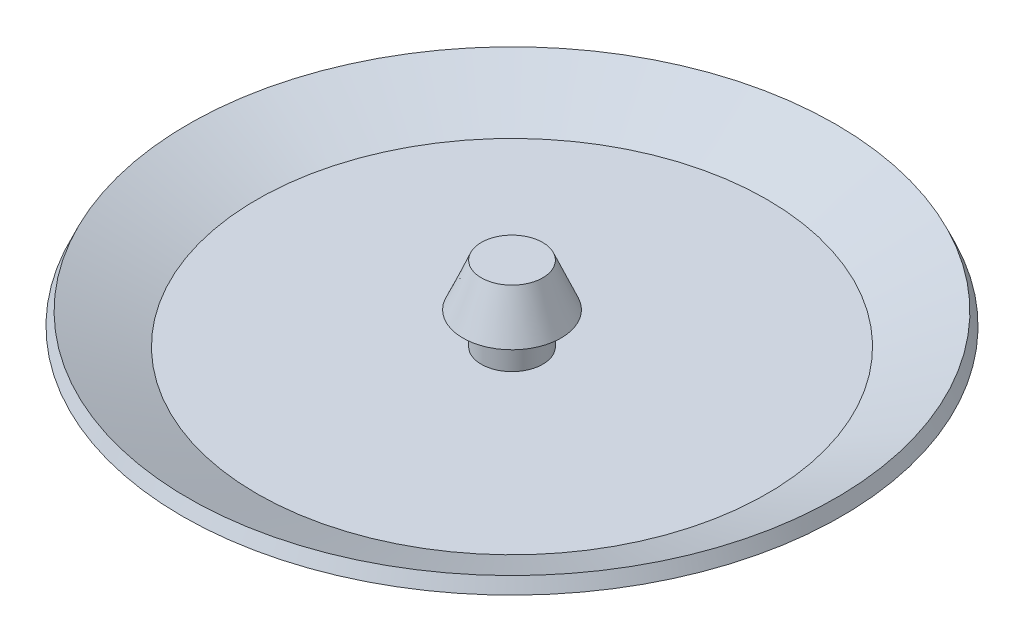
ISO-10303-21;
HEADER;
FILE_DESCRIPTION(('STEP AP214'),'2;1');
FILE_NAME('part.step','',(''),(''),'','','');
FILE_SCHEMA(('AUTOMOTIVE_DESIGN { 1 0 10303 214 1 1 1 1 }'));
ENDSEC;
DATA;
#1=APPLICATION_CONTEXT('core data for automotive mechanical design processes');
#2=APPLICATION_PROTOCOL_DEFINITION('international standard','automotive_design',2000,#1);
#3=PRODUCT_CONTEXT('',#1,'mechanical');
#4=PRODUCT('Part','Part','',(#3));
#5=PRODUCT_RELATED_PRODUCT_CATEGORY('part','',(#4));
#6=PRODUCT_DEFINITION_FORMATION('','',#4);
#7=PRODUCT_DEFINITION_CONTEXT('part definition',#1,'design');
#8=PRODUCT_DEFINITION('design','',#6,#7);
#9=PRODUCT_DEFINITION_SHAPE('','',#8);
#10=(LENGTH_UNIT() NAMED_UNIT(*) SI_UNIT(.MILLI.,.METRE.));
#11=(NAMED_UNIT(*) PLANE_ANGLE_UNIT() SI_UNIT($,.RADIAN.));
#12=(NAMED_UNIT(*) SI_UNIT($,.STERADIAN.) SOLID_ANGLE_UNIT());
#13=UNCERTAINTY_MEASURE_WITH_UNIT(LENGTH_MEASURE(1.E-05),#10,'distance_accuracy_value','');
#14=(GEOMETRIC_REPRESENTATION_CONTEXT(3) GLOBAL_UNCERTAINTY_ASSIGNED_CONTEXT((#13)) GLOBAL_UNIT_ASSIGNED_CONTEXT((#10,
#11,#12)) REPRESENTATION_CONTEXT('',''));
#15=CARTESIAN_POINT('',(0.,0.,0.));
#16=DIRECTION('',(0.,0.,1.));
#17=DIRECTION('',(1.,0.,0.));
#18=AXIS2_PLACEMENT_3D('',#15,#16,#17);
#19=CARTESIAN_POINT('',(10.795,0.,0.));
#20=DIRECTION('',(0.,1.,0.));
#21=DIRECTION('',(0.,0.,1.));
#22=AXIS2_PLACEMENT_3D('',#19,#20,#21);
#23=PLANE('',#22);
#24=CARTESIAN_POINT('',(0.,0.,0.));
#25=DIRECTION('',(0.,-1.,0.));
#26=DIRECTION('',(0.,0.,-1.));
#27=AXIS2_PLACEMENT_3D('',#24,#25,#26);
#28=CIRCLE('',#27,10.795);
#29=CARTESIAN_POINT('',(0.,0.,-10.795));
#30=VERTEX_POINT('',#29);
#31=EDGE_CURVE('E60',#30,#30,#28,.T.);
#32=ORIENTED_EDGE('',*,*,#31,.T.);
#33=EDGE_LOOP('',(#32));
#34=FACE_BOUND('',#33,.T.);
#35=ADVANCED_FACE('F32',(#34),#23,.F.);
#36=CARTESIAN_POINT('',(0.,3.6322,0.));
#37=DIRECTION('',(0.,-1.,0.));
#38=DIRECTION('',(0.,0.,-1.));
#39=AXIS2_PLACEMENT_3D('',#36,#37,#38);
#40=CONICAL_SURFACE('',#39,1.27,0.404891786285084);
#41=CARTESIAN_POINT('',(0.,1.8542,0.));
#42=DIRECTION('',(0.,-1.,0.));
#43=DIRECTION('',(0.,0.,-1.));
#44=AXIS2_PLACEMENT_3D('',#41,#42,#43);
#45=CIRCLE('',#44,2.032);
#46=CARTESIAN_POINT('',(0.,1.8542,-2.032));
#47=VERTEX_POINT('',#46);
#48=EDGE_CURVE('E38',#47,#47,#45,.T.);
#49=ORIENTED_EDGE('',*,*,#48,.F.);
#50=EDGE_LOOP('',(#49));
#51=FACE_BOUND('',#50,.T.);
#52=CARTESIAN_POINT('',(0.,3.6322,0.));
#53=DIRECTION('',(0.,-1.,0.));
#54=DIRECTION('',(0.,0.,-1.));
#55=AXIS2_PLACEMENT_3D('',#52,#53,#54);
#56=CIRCLE('',#55,1.27);
#57=CARTESIAN_POINT('',(0.,3.6322,-1.27));
#58=VERTEX_POINT('',#57);
#59=EDGE_CURVE('E10',#58,#58,#56,.T.);
#60=ORIENTED_EDGE('',*,*,#59,.T.);
#61=EDGE_LOOP('',(#60));
#62=FACE_BOUND('',#61,.T.);
#63=ADVANCED_FACE('F98',(#51,#62),#40,.T.);
#64=CARTESIAN_POINT('',(2.032,1.8542,0.));
#65=DIRECTION('',(0.,1.,0.));
#66=DIRECTION('',(0.,0.,1.));
#67=AXIS2_PLACEMENT_3D('',#64,#65,#66);
#68=PLANE('',#67);
#69=CARTESIAN_POINT('',(0.,1.8542,0.));
#70=DIRECTION('',(0.,-1.,0.));
#71=DIRECTION('',(0.,0.,-1.));
#72=AXIS2_PLACEMENT_3D('',#69,#70,#71);
#73=CIRCLE('',#72,1.27);
#74=CARTESIAN_POINT('',(0.,1.8542,-1.27));
#75=VERTEX_POINT('',#74);
#76=EDGE_CURVE('E42',#75,#75,#73,.T.);
#77=ORIENTED_EDGE('',*,*,#76,.F.);
#78=EDGE_LOOP('',(#77));
#79=FACE_BOUND('',#78,.T.);
#80=ORIENTED_EDGE('',*,*,#48,.T.);
#81=EDGE_LOOP('',(#80));
#82=FACE_BOUND('',#81,.T.);
#83=ADVANCED_FACE('F93',(#79,#82),#68,.F.);
#84=CARTESIAN_POINT('',(0.,0.,0.));
#85=DIRECTION('',(0.,-1.,0.));
#86=DIRECTION('',(0.,0.,-1.));
#87=AXIS2_PLACEMENT_3D('',#84,#85,#86);
#88=CYLINDRICAL_SURFACE('',#87,1.27);
#89=CARTESIAN_POINT('',(0.,0.531702222833789,0.));
#90=DIRECTION('',(0.,-1.,0.));
#91=DIRECTION('',(0.,0.,-1.));
#92=AXIS2_PLACEMENT_3D('',#89,#90,#91);
#93=CIRCLE('',#92,1.27);
#94=CARTESIAN_POINT('',(0.,0.531702222833789,-1.27));
#95=VERTEX_POINT('',#94);
#96=EDGE_CURVE('E46',#95,#95,#93,.T.);
#97=ORIENTED_EDGE('',*,*,#96,.F.);
#98=EDGE_LOOP('',(#97));
#99=FACE_BOUND('',#98,.T.);
#100=ORIENTED_EDGE('',*,*,#76,.T.);
#101=EDGE_LOOP('',(#100));
#102=FACE_BOUND('',#101,.T.);
#103=ADVANCED_FACE('F87',(#99,#102),#88,.T.);
#104=CARTESIAN_POINT('',(1.27,0.531702222833789,0.));
#105=DIRECTION('',(0.,-1.,0.));
#106=DIRECTION('',(0.,0.,-1.));
#107=AXIS2_PLACEMENT_3D('',#104,#105,#106);
#108=PLANE('',#107);
#109=CARTESIAN_POINT('',(0.,0.531702222833789,0.));
#110=DIRECTION('',(0.,-1.,0.));
#111=DIRECTION('',(0.,0.,-1.));
#112=AXIS2_PLACEMENT_3D('',#109,#110,#111);
#113=CIRCLE('',#112,10.5529177663125);
#114=CARTESIAN_POINT('',(0.,0.531702222833789,-10.5529177663125));
#115=VERTEX_POINT('',#114);
#116=EDGE_CURVE('E51',#115,#115,#113,.T.);
#117=ORIENTED_EDGE('',*,*,#116,.F.);
#118=EDGE_LOOP('',(#117));
#119=FACE_BOUND('',#118,.T.);
#120=ORIENTED_EDGE('',*,*,#96,.T.);
#121=EDGE_LOOP('',(#120));
#122=FACE_BOUND('',#121,.T.);
#123=ADVANCED_FACE('F81',(#119,#122),#108,.F.);
#124=CARTESIAN_POINT('',(0.,0.531702222833789,0.));
#125=DIRECTION('',(0.,1.,0.));
#126=DIRECTION('',(0.,0.,1.));
#127=AXIS2_PLACEMENT_3D('',#124,#125,#126);
#128=CONICAL_SURFACE('',#127,10.5529177663125,1.1514688346578);
#129=CARTESIAN_POINT('',(0.,1.80170222283378,0.));
#130=DIRECTION('',(0.,-1.,0.));
#131=DIRECTION('',(0.,0.,-1.));
#132=AXIS2_PLACEMENT_3D('',#129,#130,#131);
#133=CIRCLE('',#132,13.4019451307188);
#134=CARTESIAN_POINT('',(0.,1.80170222283378,-13.4019451307188));
#135=VERTEX_POINT('',#134);
#136=EDGE_CURVE('E54',#135,#135,#133,.T.);
#137=ORIENTED_EDGE('',*,*,#136,.F.);
#138=EDGE_LOOP('',(#137));
#139=FACE_BOUND('',#138,.T.);
#140=ORIENTED_EDGE('',*,*,#116,.T.);
#141=EDGE_LOOP('',(#140));
#142=FACE_BOUND('',#141,.T.);
#143=ADVANCED_FACE('F75',(#139,#142),#128,.F.);
#144=CARTESIAN_POINT('',(0.,1.80170222283378,0.));
#145=DIRECTION('',(0.,-1.,0.));
#146=DIRECTION('',(0.,0.,-1.));
#147=AXIS2_PLACEMENT_3D('',#144,#145,#146);
#148=CONICAL_SURFACE('',#147,13.4019451307188,0.419327492137084);
#149=CARTESIAN_POINT('',(0.,1.26811558398381,0.));
#150=DIRECTION('',(0.,-1.,0.));
#151=DIRECTION('',(0.,0.,-1.));
#152=AXIS2_PLACEMENT_3D('',#149,#150,#151);
#153=CIRCLE('',#152,13.6398);
#154=CARTESIAN_POINT('',(0.,1.26811558398381,-13.6398));
#155=VERTEX_POINT('',#154);
#156=EDGE_CURVE('E57',#155,#155,#153,.T.);
#157=ORIENTED_EDGE('',*,*,#156,.F.);
#158=EDGE_LOOP('',(#157));
#159=FACE_BOUND('',#158,.T.);
#160=ORIENTED_EDGE('',*,*,#136,.T.);
#161=EDGE_LOOP('',(#160));
#162=FACE_BOUND('',#161,.T.);
#163=ADVANCED_FACE('F69',(#159,#162),#148,.T.);
#164=CARTESIAN_POINT('',(0.,1.26811558398381,0.));
#165=DIRECTION('',(0.,1.,0.));
#166=DIRECTION('',(0.,0.,1.));
#167=AXIS2_PLACEMENT_3D('',#164,#165,#166);
#168=CONICAL_SURFACE('',#167,13.6398,1.1514688346578);
#169=ORIENTED_EDGE('',*,*,#31,.F.);
#170=EDGE_LOOP('',(#169));
#171=FACE_BOUND('',#170,.T.);
#172=ORIENTED_EDGE('',*,*,#156,.T.);
#173=EDGE_LOOP('',(#172));
#174=FACE_BOUND('',#173,.T.);
#175=ADVANCED_FACE('F65',(#171,#174),#168,.T.);
#176=CARTESIAN_POINT('',(1.27,3.6322,-13.6398));
#177=DIRECTION('',(0.,1.,0.));
#178=DIRECTION('',(0.,0.,1.));
#179=AXIS2_PLACEMENT_3D('',#176,#177,#178);
#180=PLANE('',#179);
#181=ORIENTED_EDGE('',*,*,#59,.F.);
#182=EDGE_LOOP('',(#181));
#183=FACE_BOUND('',#182,.T.);
#184=ADVANCED_FACE('F68',(#183),#180,.T.);
#185=CLOSED_SHELL('',(#35,#63,#83,#103,#123,#143,#163,#175,#184));
#186=MANIFOLD_SOLID_BREP('B2',#185);
#187=ADVANCED_BREP_SHAPE_REPRESENTATION('',(#18,#186),#14);
#188=SHAPE_DEFINITION_REPRESENTATION(#9,#187);
ENDSEC;
END-ISO-10303-21;
